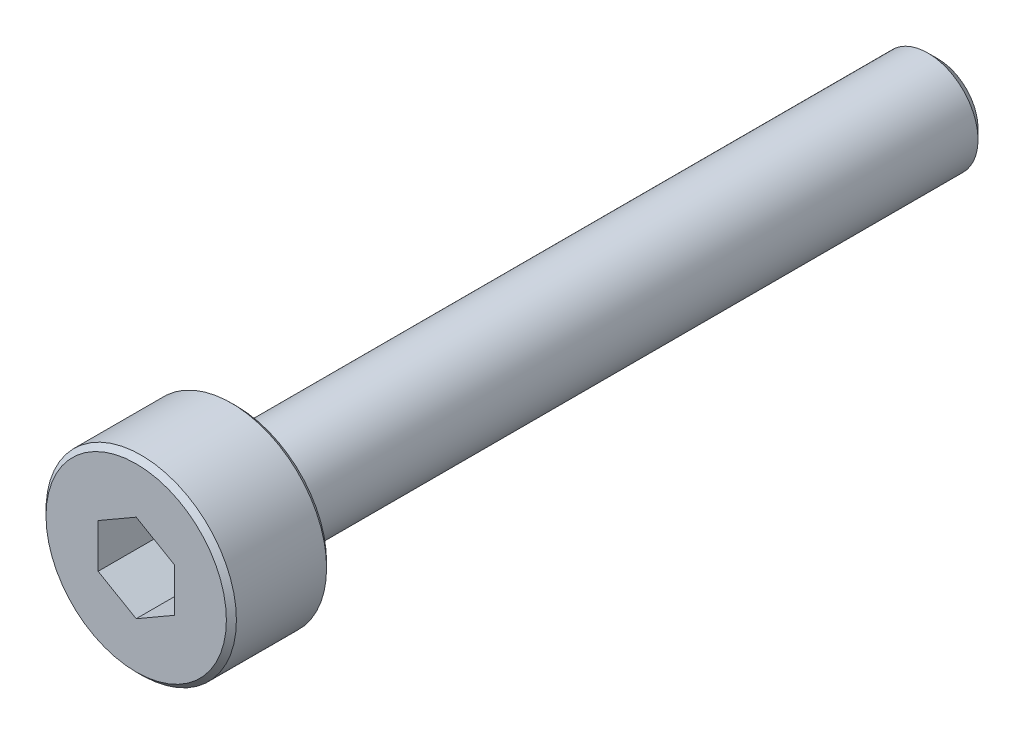
ISO-10303-21;
HEADER;
FILE_DESCRIPTION(('STEP AP214'),'2;1');
FILE_NAME('part.step','',(''),(''),'','','');
FILE_SCHEMA(('AUTOMOTIVE_DESIGN { 1 0 10303 214 1 1 1 1 }'));
ENDSEC;
DATA;
#1=APPLICATION_CONTEXT('core data for automotive mechanical design processes');
#2=APPLICATION_PROTOCOL_DEFINITION('international standard','automotive_design',2000,#1);
#3=PRODUCT_CONTEXT('',#1,'mechanical');
#4=PRODUCT('Part','Part','',(#3));
#5=PRODUCT_RELATED_PRODUCT_CATEGORY('part','',(#4));
#6=PRODUCT_DEFINITION_FORMATION('','',#4);
#7=PRODUCT_DEFINITION_CONTEXT('part definition',#1,'design');
#8=PRODUCT_DEFINITION('design','',#6,#7);
#9=PRODUCT_DEFINITION_SHAPE('','',#8);
#10=(LENGTH_UNIT() NAMED_UNIT(*) SI_UNIT(.MILLI.,.METRE.));
#11=(NAMED_UNIT(*) PLANE_ANGLE_UNIT() SI_UNIT($,.RADIAN.));
#12=(NAMED_UNIT(*) SI_UNIT($,.STERADIAN.) SOLID_ANGLE_UNIT());
#13=UNCERTAINTY_MEASURE_WITH_UNIT(LENGTH_MEASURE(1.E-05),#10,'distance_accuracy_value','');
#14=(GEOMETRIC_REPRESENTATION_CONTEXT(3) GLOBAL_UNCERTAINTY_ASSIGNED_CONTEXT((#13)) GLOBAL_UNIT_ASSIGNED_CONTEXT((#10,
#11,#12)) REPRESENTATION_CONTEXT('',''));
#15=CARTESIAN_POINT('',(0.,0.,0.));
#16=DIRECTION('',(0.,0.,1.));
#17=DIRECTION('',(1.,0.,0.));
#18=AXIS2_PLACEMENT_3D('',#15,#16,#17);
#19=CARTESIAN_POINT('',(0.,0.,10.));
#20=DIRECTION('',(0.,0.,1.));
#21=DIRECTION('',(1.,0.,0.));
#22=AXIS2_PLACEMENT_3D('',#19,#20,#21);
#23=CYLINDRICAL_SURFACE('',#22,1.9);
#24=CARTESIAN_POINT('',(0.,0.,10.1000007633703));
#25=DIRECTION('',(0.,0.,-1.));
#26=DIRECTION('',(-1.,0.,0.));
#27=AXIS2_PLACEMENT_3D('',#24,#25,#26);
#28=CIRCLE('',#27,1.9);
#29=CARTESIAN_POINT('',(-1.9,0.,10.1000007633703));
#30=VERTEX_POINT('',#29);
#31=EDGE_CURVE('E153',#30,#30,#28,.F.);
#32=ORIENTED_EDGE('',*,*,#31,.T.);
#33=EDGE_LOOP('',(#32));
#34=FACE_BOUND('',#33,.T.);
#35=CARTESIAN_POINT('',(0.,0.,11.8999991776262));
#36=DIRECTION('',(0.,0.,1.));
#37=DIRECTION('',(1.,0.,0.));
#38=AXIS2_PLACEMENT_3D('',#35,#36,#37);
#39=CIRCLE('',#38,1.9);
#40=CARTESIAN_POINT('',(1.9,0.,11.8999991776262));
#41=VERTEX_POINT('',#40);
#42=EDGE_CURVE('E150',#41,#41,#39,.F.);
#43=ORIENTED_EDGE('',*,*,#42,.T.);
#44=EDGE_LOOP('',(#43));
#45=FACE_BOUND('',#44,.T.);
#46=ADVANCED_FACE('F39',(#34,#45),#23,.T.);
#47=CARTESIAN_POINT('',(1.9,0.,10.));
#48=DIRECTION('',(0.,0.,-1.));
#49=DIRECTION('',(-1.,0.,0.));
#50=AXIS2_PLACEMENT_3D('',#47,#48,#49);
#51=PLANE('',#50);
#52=CARTESIAN_POINT('',(0.,0.,10.));
#53=DIRECTION('',(0.,0.,-1.));
#54=DIRECTION('',(-1.,0.,0.));
#55=AXIS2_PLACEMENT_3D('',#52,#53,#54);
#56=CIRCLE('',#55,1.79999917762621);
#57=CARTESIAN_POINT('',(-1.79999917762621,0.,10.));
#58=VERTEX_POINT('',#57);
#59=EDGE_CURVE('E156',#58,#58,#56,.T.);
#60=ORIENTED_EDGE('',*,*,#59,.T.);
#61=EDGE_LOOP('',(#60));
#62=FACE_BOUND('',#61,.T.);
#63=CARTESIAN_POINT('',(0.,0.,10.));
#64=DIRECTION('',(0.,0.,-1.));
#65=DIRECTION('',(-1.,0.,0.));
#66=AXIS2_PLACEMENT_3D('',#63,#64,#65);
#67=CIRCLE('',#66,1.);
#68=CARTESIAN_POINT('',(-1.,0.,10.));
#69=VERTEX_POINT('',#68);
#70=EDGE_CURVE('E142',#69,#69,#67,.T.);
#71=ORIENTED_EDGE('',*,*,#70,.F.);
#72=EDGE_LOOP('',(#71));
#73=FACE_BOUND('',#72,.T.);
#74=ADVANCED_FACE('F176',(#62,#73),#51,.T.);
#75=CARTESIAN_POINT('',(0.,0.,12.));
#76=DIRECTION('',(0.,0.,1.));
#77=DIRECTION('',(1.,0.,0.));
#78=AXIS2_PLACEMENT_3D('',#75,#76,#77);
#79=PLANE('',#78);
#80=CARTESIAN_POINT('',(0.,0.,12.));
#81=DIRECTION('',(0.,0.,1.));
#82=DIRECTION('',(1.,0.,0.));
#83=AXIS2_PLACEMENT_3D('',#80,#81,#82);
#84=CIRCLE('',#83,1.79999923662968);
#85=CARTESIAN_POINT('',(1.79999923662968,0.,12.));
#86=VERTEX_POINT('',#85);
#87=EDGE_CURVE('E159',#86,#86,#84,.T.);
#88=ORIENTED_EDGE('',*,*,#87,.T.);
#89=EDGE_LOOP('',(#88));
#90=FACE_BOUND('',#89,.T.);
#91=DIRECTION('',(0.,-1.,0.));
#92=VECTOR('',#91,1.);
#93=CARTESIAN_POINT('',(-0.759999999999996,0.438786204584093,12.));
#94=LINE('',#93,#92);
#95=CARTESIAN_POINT('',(-0.759999999999996,0.438786204584093,12.));
#96=VERTEX_POINT('',#95);
#97=CARTESIAN_POINT('',(-0.76,-0.4387862045841,12.));
#98=VERTEX_POINT('',#97);
#99=EDGE_CURVE('E55',#96,#98,#94,.T.);
#100=ORIENTED_EDGE('',*,*,#99,.F.);
#101=DIRECTION('',(-0.866025403784438,-0.500000000000002,0.));
#102=VECTOR('',#101,1.);
#103=CARTESIAN_POINT('',(0.,0.877572409168213,12.));
#104=LINE('',#103,#102);
#105=CARTESIAN_POINT('',(0.,0.877572409168213,12.));
#106=VERTEX_POINT('',#105);
#107=EDGE_CURVE('E138',#106,#96,#104,.T.);
#108=ORIENTED_EDGE('',*,*,#107,.F.);
#109=DIRECTION('',(-0.866025403784438,0.500000000000002,0.));
#110=VECTOR('',#109,1.);
#111=CARTESIAN_POINT('',(0.76,0.4387862045841,12.));
#112=LINE('',#111,#110);
#113=CARTESIAN_POINT('',(0.76,0.4387862045841,12.));
#114=VERTEX_POINT('',#113);
#115=EDGE_CURVE('E136',#114,#106,#112,.T.);
#116=ORIENTED_EDGE('',*,*,#115,.F.);
#117=DIRECTION('',(0.,1.,0.));
#118=VECTOR('',#117,1.);
#119=CARTESIAN_POINT('',(0.759999999999996,-0.438786204584093,12.));
#120=LINE('',#119,#118);
#121=CARTESIAN_POINT('',(0.759999999999996,-0.438786204584093,12.));
#122=VERTEX_POINT('',#121);
#123=EDGE_CURVE('E103',#122,#114,#120,.T.);
#124=ORIENTED_EDGE('',*,*,#123,.F.);
#125=DIRECTION('',(0.86602540378444,0.499999999999998,0.));
#126=VECTOR('',#125,1.);
#127=CARTESIAN_POINT('',(0.,-0.877572409168207,12.));
#128=LINE('',#127,#126);
#129=CARTESIAN_POINT('',(0.,-0.877572409168207,12.));
#130=VERTEX_POINT('',#129);
#131=EDGE_CURVE('E132',#130,#122,#128,.T.);
#132=ORIENTED_EDGE('',*,*,#131,.F.);
#133=DIRECTION('',(0.866025403784442,-0.499999999999994,0.));
#134=VECTOR('',#133,1.);
#135=CARTESIAN_POINT('',(-0.76,-0.4387862045841,12.));
#136=LINE('',#135,#134);
#137=EDGE_CURVE('E129',#98,#130,#136,.T.);
#138=ORIENTED_EDGE('',*,*,#137,.F.);
#139=EDGE_LOOP('',(#100,#108,#116,#124,#132,#138));
#140=FACE_BOUND('',#139,.T.);
#141=ADVANCED_FACE('F182',(#90,#140),#79,.T.);
#142=CARTESIAN_POINT('',(0.,0.,-4.));
#143=DIRECTION('',(0.,0.,1.));
#144=DIRECTION('',(1.,0.,0.));
#145=AXIS2_PLACEMENT_3D('',#142,#143,#144);
#146=CYLINDRICAL_SURFACE('',#145,1.);
#147=CARTESIAN_POINT('',(0.,0.,-3.79998954454024));
#148=DIRECTION('',(0.,0.,-1.));
#149=DIRECTION('',(-1.,0.,0.));
#150=AXIS2_PLACEMENT_3D('',#147,#148,#149);
#151=CIRCLE('',#150,1.);
#152=CARTESIAN_POINT('',(-1.,0.,-3.79998954454024));
#153=VERTEX_POINT('',#152);
#154=EDGE_CURVE('E11',#153,#153,#151,.F.);
#155=ORIENTED_EDGE('',*,*,#154,.T.);
#156=EDGE_LOOP('',(#155));
#157=FACE_BOUND('',#156,.T.);
#158=ORIENTED_EDGE('',*,*,#70,.T.);
#159=EDGE_LOOP('',(#158));
#160=FACE_BOUND('',#159,.T.);
#161=ADVANCED_FACE('F209',(#157,#160),#146,.T.);
#162=CARTESIAN_POINT('',(0.,0.,-4.));
#163=DIRECTION('',(0.,0.,-1.));
#164=DIRECTION('',(-1.,0.,0.));
#165=AXIS2_PLACEMENT_3D('',#162,#163,#164);
#166=PLANE('',#165);
#167=CARTESIAN_POINT('',(0.,0.,-4.));
#168=DIRECTION('',(0.,0.,-1.));
#169=DIRECTION('',(-1.,0.,0.));
#170=AXIS2_PLACEMENT_3D('',#167,#168,#169);
#171=CIRCLE('',#170,0.799991635727209);
#172=CARTESIAN_POINT('',(-0.799991635727209,0.,-4.));
#173=VERTEX_POINT('',#172);
#174=EDGE_CURVE('E48',#173,#173,#171,.T.);
#175=ORIENTED_EDGE('',*,*,#174,.T.);
#176=EDGE_LOOP('',(#175));
#177=FACE_BOUND('',#176,.T.);
#178=ADVANCED_FACE('F164',(#177),#166,.T.);
#179=CARTESIAN_POINT('',(-0.759999999999996,0.438786204584093,10.5));
#180=DIRECTION('',(-1.,0.,0.));
#181=DIRECTION('',(0.,-1.,0.));
#182=AXIS2_PLACEMENT_3D('',#179,#180,#181);
#183=PLANE('',#182);
#184=ORIENTED_EDGE('',*,*,#99,.T.);
#185=DIRECTION('',(0.,0.,1.));
#186=VECTOR('',#185,1.);
#187=CARTESIAN_POINT('',(-0.76,-0.4387862045841,10.5));
#188=LINE('',#187,#186);
#189=CARTESIAN_POINT('',(-0.76,-0.4387862045841,10.5));
#190=VERTEX_POINT('',#189);
#191=EDGE_CURVE('E85',#190,#98,#188,.T.);
#192=ORIENTED_EDGE('',*,*,#191,.F.);
#193=DIRECTION('',(0.,-1.,0.));
#194=VECTOR('',#193,1.);
#195=CARTESIAN_POINT('',(-0.759999999999996,0.438786204584093,10.5));
#196=LINE('',#195,#194);
#197=CARTESIAN_POINT('',(-0.759999999999996,0.438786204584093,10.5));
#198=VERTEX_POINT('',#197);
#199=EDGE_CURVE('E140',#198,#190,#196,.T.);
#200=ORIENTED_EDGE('',*,*,#199,.F.);
#201=DIRECTION('',(0.,0.,1.));
#202=VECTOR('',#201,1.);
#203=CARTESIAN_POINT('',(-0.759999999999996,0.438786204584093,10.5));
#204=LINE('',#203,#202);
#205=EDGE_CURVE('E63',#198,#96,#204,.T.);
#206=ORIENTED_EDGE('',*,*,#205,.T.);
#207=EDGE_LOOP('',(#184,#192,#200,#206));
#208=FACE_BOUND('',#207,.T.);
#209=ADVANCED_FACE('F217',(#208),#183,.F.);
#210=CARTESIAN_POINT('',(0.,0.877572409168213,10.5));
#211=DIRECTION('',(-0.500000000000002,0.866025403784438,0.));
#212=DIRECTION('',(-0.866025403784438,-0.500000000000002,0.));
#213=AXIS2_PLACEMENT_3D('',#210,#211,#212);
#214=PLANE('',#213);
#215=ORIENTED_EDGE('',*,*,#107,.T.);
#216=ORIENTED_EDGE('',*,*,#205,.F.);
#217=DIRECTION('',(-0.866025403784438,-0.500000000000002,0.));
#218=VECTOR('',#217,1.);
#219=CARTESIAN_POINT('',(0.,0.877572409168213,10.5));
#220=LINE('',#219,#218);
#221=CARTESIAN_POINT('',(0.,0.877572409168213,10.5));
#222=VERTEX_POINT('',#221);
#223=EDGE_CURVE('E115',#222,#198,#220,.T.);
#224=ORIENTED_EDGE('',*,*,#223,.F.);
#225=DIRECTION('',(0.,0.,1.));
#226=VECTOR('',#225,1.);
#227=CARTESIAN_POINT('',(0.,0.877572409168213,10.5));
#228=LINE('',#227,#226);
#229=EDGE_CURVE('E107',#222,#106,#228,.T.);
#230=ORIENTED_EDGE('',*,*,#229,.T.);
#231=EDGE_LOOP('',(#215,#216,#224,#230));
#232=FACE_BOUND('',#231,.T.);
#233=ADVANCED_FACE('F223',(#232),#214,.F.);
#234=CARTESIAN_POINT('',(0.76,0.4387862045841,10.5));
#235=DIRECTION('',(0.500000000000002,0.866025403784438,0.));
#236=DIRECTION('',(-0.866025403784438,0.500000000000002,0.));
#237=AXIS2_PLACEMENT_3D('',#234,#235,#236);
#238=PLANE('',#237);
#239=ORIENTED_EDGE('',*,*,#115,.T.);
#240=ORIENTED_EDGE('',*,*,#229,.F.);
#241=DIRECTION('',(-0.866025403784438,0.500000000000002,0.));
#242=VECTOR('',#241,1.);
#243=CARTESIAN_POINT('',(0.76,0.4387862045841,10.5));
#244=LINE('',#243,#242);
#245=CARTESIAN_POINT('',(0.76,0.4387862045841,10.5));
#246=VERTEX_POINT('',#245);
#247=EDGE_CURVE('E111',#246,#222,#244,.T.);
#248=ORIENTED_EDGE('',*,*,#247,.F.);
#249=DIRECTION('',(0.,0.,1.));
#250=VECTOR('',#249,1.);
#251=CARTESIAN_POINT('',(0.76,0.4387862045841,10.5));
#252=LINE('',#251,#250);
#253=EDGE_CURVE('E96',#246,#114,#252,.T.);
#254=ORIENTED_EDGE('',*,*,#253,.T.);
#255=EDGE_LOOP('',(#239,#240,#248,#254));
#256=FACE_BOUND('',#255,.T.);
#257=ADVANCED_FACE('F112',(#256),#238,.F.);
#258=CARTESIAN_POINT('',(0.759999999999996,-0.438786204584093,10.5));
#259=DIRECTION('',(1.,0.,0.));
#260=DIRECTION('',(0.,1.,0.));
#261=AXIS2_PLACEMENT_3D('',#258,#259,#260);
#262=PLANE('',#261);
#263=ORIENTED_EDGE('',*,*,#123,.T.);
#264=ORIENTED_EDGE('',*,*,#253,.F.);
#265=DIRECTION('',(0.,1.,0.));
#266=VECTOR('',#265,1.);
#267=CARTESIAN_POINT('',(0.759999999999996,-0.438786204584093,10.5));
#268=LINE('',#267,#266);
#269=CARTESIAN_POINT('',(0.759999999999996,-0.438786204584093,10.5));
#270=VERTEX_POINT('',#269);
#271=EDGE_CURVE('E100',#270,#246,#268,.T.);
#272=ORIENTED_EDGE('',*,*,#271,.F.);
#273=DIRECTION('',(0.,0.,1.));
#274=VECTOR('',#273,1.);
#275=CARTESIAN_POINT('',(0.759999999999996,-0.438786204584093,10.5));
#276=LINE('',#275,#274);
#277=EDGE_CURVE('E108',#270,#122,#276,.T.);
#278=ORIENTED_EDGE('',*,*,#277,.T.);
#279=EDGE_LOOP('',(#263,#264,#272,#278));
#280=FACE_BOUND('',#279,.T.);
#281=ADVANCED_FACE('F98',(#280),#262,.F.);
#282=CARTESIAN_POINT('',(0.,-0.877572409168207,10.5));
#283=DIRECTION('',(0.499999999999998,-0.86602540378444,0.));
#284=DIRECTION('',(0.86602540378444,0.499999999999998,0.));
#285=AXIS2_PLACEMENT_3D('',#282,#283,#284);
#286=PLANE('',#285);
#287=ORIENTED_EDGE('',*,*,#131,.T.);
#288=ORIENTED_EDGE('',*,*,#277,.F.);
#289=DIRECTION('',(0.86602540378444,0.499999999999998,0.));
#290=VECTOR('',#289,1.);
#291=CARTESIAN_POINT('',(0.,-0.877572409168207,10.5));
#292=LINE('',#291,#290);
#293=CARTESIAN_POINT('',(0.,-0.877572409168207,10.5));
#294=VERTEX_POINT('',#293);
#295=EDGE_CURVE('E121',#294,#270,#292,.T.);
#296=ORIENTED_EDGE('',*,*,#295,.F.);
#297=DIRECTION('',(0.,0.,1.));
#298=VECTOR('',#297,1.);
#299=CARTESIAN_POINT('',(0.,-0.877572409168207,10.5));
#300=LINE('',#299,#298);
#301=EDGE_CURVE('E145',#294,#130,#300,.T.);
#302=ORIENTED_EDGE('',*,*,#301,.T.);
#303=EDGE_LOOP('',(#287,#288,#296,#302));
#304=FACE_BOUND('',#303,.T.);
#305=ADVANCED_FACE('F226',(#304),#286,.F.);
#306=CARTESIAN_POINT('',(-0.76,-0.4387862045841,10.5));
#307=DIRECTION('',(-0.499999999999994,-0.866025403784442,0.));
#308=DIRECTION('',(0.866025403784442,-0.499999999999994,0.));
#309=AXIS2_PLACEMENT_3D('',#306,#307,#308);
#310=PLANE('',#309);
#311=ORIENTED_EDGE('',*,*,#137,.T.);
#312=ORIENTED_EDGE('',*,*,#301,.F.);
#313=DIRECTION('',(0.866025403784442,-0.499999999999994,0.));
#314=VECTOR('',#313,1.);
#315=CARTESIAN_POINT('',(-0.76,-0.4387862045841,10.5));
#316=LINE('',#315,#314);
#317=EDGE_CURVE('E123',#190,#294,#316,.T.);
#318=ORIENTED_EDGE('',*,*,#317,.F.);
#319=ORIENTED_EDGE('',*,*,#191,.T.);
#320=EDGE_LOOP('',(#311,#312,#318,#319));
#321=FACE_BOUND('',#320,.T.);
#322=ADVANCED_FACE('F201',(#321),#310,.F.);
#323=CARTESIAN_POINT('',(0.,0.,10.5));
#324=DIRECTION('',(0.,0.,1.));
#325=DIRECTION('',(1.,0.,0.));
#326=AXIS2_PLACEMENT_3D('',#323,#324,#325);
#327=PLANE('',#326);
#328=ORIENTED_EDGE('',*,*,#199,.T.);
#329=ORIENTED_EDGE('',*,*,#317,.T.);
#330=ORIENTED_EDGE('',*,*,#295,.T.);
#331=ORIENTED_EDGE('',*,*,#271,.T.);
#332=ORIENTED_EDGE('',*,*,#247,.T.);
#333=ORIENTED_EDGE('',*,*,#223,.T.);
#334=EDGE_LOOP('',(#328,#329,#330,#331,#332,#333));
#335=FACE_BOUND('',#334,.T.);
#336=ADVANCED_FACE('F118',(#335),#327,.T.);
#337=CARTESIAN_POINT('',(0.,0.,10.1000007633703));
#338=DIRECTION('',(0.,0.,1.));
#339=DIRECTION('',(1.,0.,0.));
#340=AXIS2_PLACEMENT_3D('',#337,#338,#339);
#341=CONICAL_SURFACE('',#340,1.9,0.785398458412441);
#342=ORIENTED_EDGE('',*,*,#59,.F.);
#343=EDGE_LOOP('',(#342));
#344=FACE_BOUND('',#343,.T.);
#345=ORIENTED_EDGE('',*,*,#31,.F.);
#346=EDGE_LOOP('',(#345));
#347=FACE_BOUND('',#346,.T.);
#348=ADVANCED_FACE('F172',(#344,#347),#341,.T.);
#349=CARTESIAN_POINT('',(0.,0.,12.));
#350=DIRECTION('',(0.,0.,-1.));
#351=DIRECTION('',(-1.,0.,0.));
#352=AXIS2_PLACEMENT_3D('',#349,#350,#351);
#353=CONICAL_SURFACE('',#352,1.79999923662968,0.785397868382449);
#354=ORIENTED_EDGE('',*,*,#42,.F.);
#355=EDGE_LOOP('',(#354));
#356=FACE_BOUND('',#355,.T.);
#357=ORIENTED_EDGE('',*,*,#87,.F.);
#358=EDGE_LOOP('',(#357));
#359=FACE_BOUND('',#358,.T.);
#360=ADVANCED_FACE('F167',(#356,#359),#353,.T.);
#361=CARTESIAN_POINT('',(0.,0.,-4.));
#362=DIRECTION('',(0.,0.,1.));
#363=DIRECTION('',(1.,0.,0.));
#364=AXIS2_PLACEMENT_3D('',#361,#362,#363);
#365=CONICAL_SURFACE('',#364,0.799991635727209,0.78539293567599);
#366=ORIENTED_EDGE('',*,*,#154,.F.);
#367=EDGE_LOOP('',(#366));
#368=FACE_BOUND('',#367,.T.);
#369=ORIENTED_EDGE('',*,*,#174,.F.);
#370=EDGE_LOOP('',(#369));
#371=FACE_BOUND('',#370,.T.);
#372=ADVANCED_FACE('F42',(#368,#371),#365,.T.);
#373=CLOSED_SHELL('',(#46,#74,#141,#161,#178,#209,#233,#257,#281,#305,#322,#336,#348,#360,#372));
#374=MANIFOLD_SOLID_BREP('B2',#373);
#375=ADVANCED_BREP_SHAPE_REPRESENTATION('',(#18,#374),#14);
#376=SHAPE_DEFINITION_REPRESENTATION(#9,#375);
ENDSEC;
END-ISO-10303-21;
